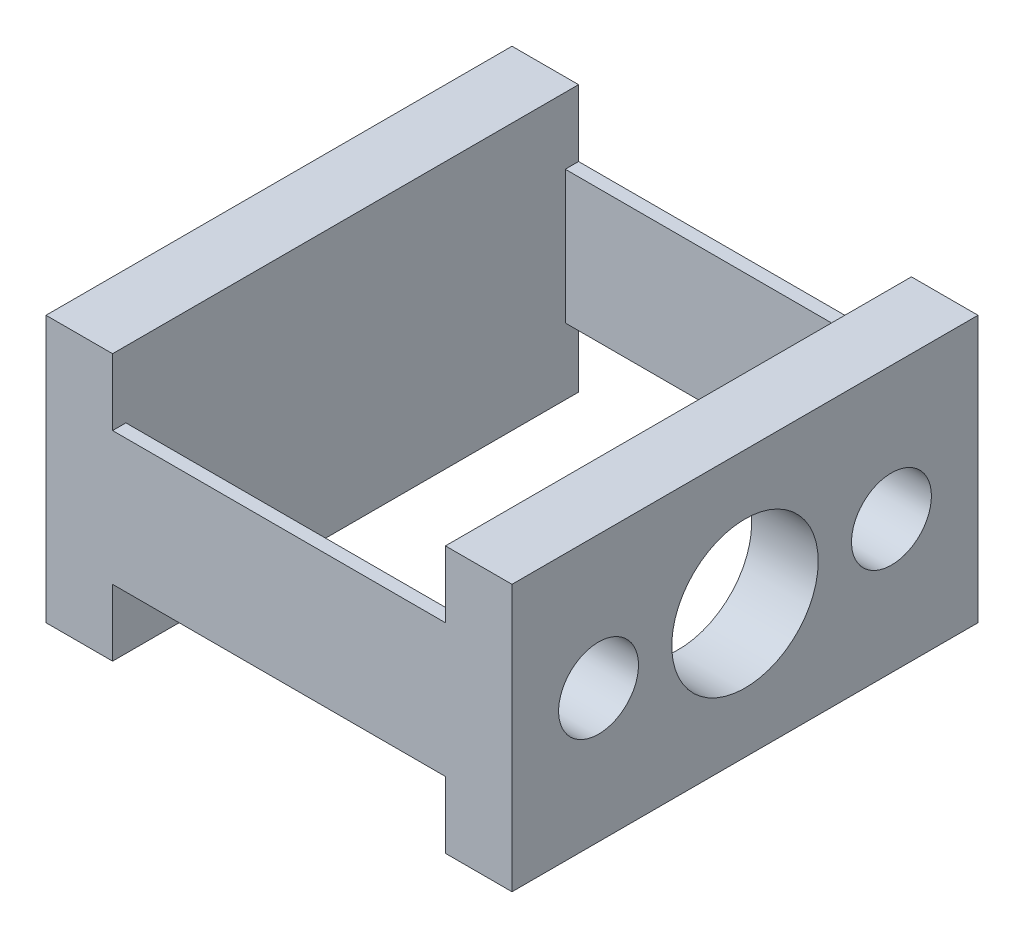
ISO-10303-21;
HEADER;
FILE_DESCRIPTION(('STEP AP214'),'2;1');
FILE_NAME('part.step','',(''),(''),'','','');
FILE_SCHEMA(('AUTOMOTIVE_DESIGN { 1 0 10303 214 1 1 1 1 }'));
ENDSEC;
DATA;
#1=APPLICATION_CONTEXT('core data for automotive mechanical design processes');
#2=APPLICATION_PROTOCOL_DEFINITION('international standard','automotive_design',2000,#1);
#3=PRODUCT_CONTEXT('',#1,'mechanical');
#4=PRODUCT('Part','Part','',(#3));
#5=PRODUCT_RELATED_PRODUCT_CATEGORY('part','',(#4));
#6=PRODUCT_DEFINITION_FORMATION('','',#4);
#7=PRODUCT_DEFINITION_CONTEXT('part definition',#1,'design');
#8=PRODUCT_DEFINITION('design','',#6,#7);
#9=PRODUCT_DEFINITION_SHAPE('','',#8);
#10=(LENGTH_UNIT() NAMED_UNIT(*) SI_UNIT(.MILLI.,.METRE.));
#11=(NAMED_UNIT(*) PLANE_ANGLE_UNIT() SI_UNIT($,.RADIAN.));
#12=(NAMED_UNIT(*) SI_UNIT($,.STERADIAN.) SOLID_ANGLE_UNIT());
#13=UNCERTAINTY_MEASURE_WITH_UNIT(LENGTH_MEASURE(1.E-05),#10,'distance_accuracy_value','');
#14=(GEOMETRIC_REPRESENTATION_CONTEXT(3) GLOBAL_UNCERTAINTY_ASSIGNED_CONTEXT((#13)) GLOBAL_UNIT_ASSIGNED_CONTEXT((#10,
#11,#12)) REPRESENTATION_CONTEXT('',''));
#15=CARTESIAN_POINT('',(0.,0.,0.));
#16=DIRECTION('',(0.,0.,1.));
#17=DIRECTION('',(1.,0.,0.));
#18=AXIS2_PLACEMENT_3D('',#15,#16,#17);
#19=CARTESIAN_POINT('',(32.8580938077791,-20.,70.));
#20=DIRECTION('',(0.,1.,0.));
#21=DIRECTION('',(-1.,0.,0.));
#22=AXIS2_PLACEMENT_3D('',#19,#20,#21);
#23=PLANE('',#22);
#24=DIRECTION('',(0.,0.,-1.));
#25=VECTOR('',#24,1.);
#26=CARTESIAN_POINT('',(-17.1419061922209,-20.,70.));
#27=LINE('',#26,#25);
#28=CARTESIAN_POINT('',(-17.1419061922209,-20.,70.));
#29=VERTEX_POINT('',#28);
#30=CARTESIAN_POINT('',(-17.1419061922209,-20.,68.));
#31=VERTEX_POINT('',#30);
#32=EDGE_CURVE('E192',#29,#31,#27,.T.);
#33=ORIENTED_EDGE('',*,*,#32,.T.);
#34=DIRECTION('',(1.,0.,0.));
#35=VECTOR('',#34,1.);
#36=CARTESIAN_POINT('',(32.8580938077791,-20.,68.));
#37=LINE('',#36,#35);
#38=CARTESIAN_POINT('',(32.8580938077791,-20.,68.));
#39=VERTEX_POINT('',#38);
#40=EDGE_CURVE('E248',#31,#39,#37,.T.);
#41=ORIENTED_EDGE('',*,*,#40,.T.);
#42=DIRECTION('',(0.,0.,-1.));
#43=VECTOR('',#42,1.);
#44=CARTESIAN_POINT('',(32.8580938077791,-20.,70.));
#45=LINE('',#44,#43);
#46=CARTESIAN_POINT('',(32.8580938077791,-20.,70.));
#47=VERTEX_POINT('',#46);
#48=EDGE_CURVE('E189',#47,#39,#45,.T.);
#49=ORIENTED_EDGE('',*,*,#48,.F.);
#50=DIRECTION('',(1.,0.,0.));
#51=VECTOR('',#50,1.);
#52=CARTESIAN_POINT('',(32.8580938077791,-20.,70.));
#53=LINE('',#52,#51);
#54=EDGE_CURVE('E256',#29,#47,#53,.T.);
#55=ORIENTED_EDGE('',*,*,#54,.F.);
#56=EDGE_LOOP('',(#33,#41,#49,#55));
#57=FACE_BOUND('',#56,.T.);
#58=ADVANCED_FACE('F33',(#57),#23,.F.);
#59=CARTESIAN_POINT('',(-17.1419061922209,0.,70.));
#60=DIRECTION('',(0.,-1.,0.));
#61=DIRECTION('',(0.,0.,-1.));
#62=AXIS2_PLACEMENT_3D('',#59,#60,#61);
#63=PLANE('',#62);
#64=DIRECTION('',(0.,0.,-1.));
#65=VECTOR('',#64,1.);
#66=CARTESIAN_POINT('',(32.8580938077791,0.,70.));
#67=LINE('',#66,#65);
#68=CARTESIAN_POINT('',(32.8580938077791,0.,70.));
#69=VERTEX_POINT('',#68);
#70=CARTESIAN_POINT('',(32.8580938077791,0.,68.));
#71=VERTEX_POINT('',#70);
#72=EDGE_CURVE('E174',#69,#71,#67,.T.);
#73=ORIENTED_EDGE('',*,*,#72,.T.);
#74=DIRECTION('',(1.,0.,0.));
#75=VECTOR('',#74,1.);
#76=CARTESIAN_POINT('',(-17.1419061922209,0.,68.));
#77=LINE('',#76,#75);
#78=CARTESIAN_POINT('',(-17.1419061922209,0.,68.));
#79=VERTEX_POINT('',#78);
#80=EDGE_CURVE('E157',#79,#71,#77,.T.);
#81=ORIENTED_EDGE('',*,*,#80,.F.);
#82=DIRECTION('',(0.,0.,-1.));
#83=VECTOR('',#82,1.);
#84=CARTESIAN_POINT('',(-17.1419061922209,0.,70.));
#85=LINE('',#84,#83);
#86=CARTESIAN_POINT('',(-17.1419061922209,0.,70.));
#87=VERTEX_POINT('',#86);
#88=EDGE_CURVE('E164',#87,#79,#85,.T.);
#89=ORIENTED_EDGE('',*,*,#88,.F.);
#90=DIRECTION('',(-1.,0.,0.));
#91=VECTOR('',#90,1.);
#92=CARTESIAN_POINT('',(-17.1419061922209,0.,70.));
#93=LINE('',#92,#91);
#94=EDGE_CURVE('E165',#69,#87,#93,.T.);
#95=ORIENTED_EDGE('',*,*,#94,.F.);
#96=EDGE_LOOP('',(#73,#81,#89,#95));
#97=FACE_BOUND('',#96,.T.);
#98=ADVANCED_FACE('F340',(#97),#63,.F.);
#99=CARTESIAN_POINT('',(-27.1419061922209,10.,70.));
#100=DIRECTION('',(0.,-1.,0.));
#101=DIRECTION('',(1.,0.,0.));
#102=AXIS2_PLACEMENT_3D('',#99,#100,#101);
#103=PLANE('',#102);
#104=DIRECTION('',(-1.,0.,0.));
#105=VECTOR('',#104,1.);
#106=CARTESIAN_POINT('',(-27.1419061922209,10.,0.));
#107=LINE('',#106,#105);
#108=CARTESIAN_POINT('',(-17.1419061922209,10.,0.));
#109=VERTEX_POINT('',#108);
#110=CARTESIAN_POINT('',(-27.1419061922209,10.,0.));
#111=VERTEX_POINT('',#110);
#112=EDGE_CURVE('E212',#109,#111,#107,.T.);
#113=ORIENTED_EDGE('',*,*,#112,.T.);
#114=DIRECTION('',(0.,0.,-1.));
#115=VECTOR('',#114,1.);
#116=CARTESIAN_POINT('',(-27.1419061922209,10.,70.));
#117=LINE('',#116,#115);
#118=CARTESIAN_POINT('',(-27.1419061922209,10.,70.));
#119=VERTEX_POINT('',#118);
#120=EDGE_CURVE('E41',#119,#111,#117,.T.);
#121=ORIENTED_EDGE('',*,*,#120,.F.);
#122=DIRECTION('',(-1.,0.,0.));
#123=VECTOR('',#122,1.);
#124=CARTESIAN_POINT('',(-27.1419061922209,10.,70.));
#125=LINE('',#124,#123);
#126=CARTESIAN_POINT('',(-17.1419061922209,10.,70.));
#127=VERTEX_POINT('',#126);
#128=EDGE_CURVE('E241',#127,#119,#125,.T.);
#129=ORIENTED_EDGE('',*,*,#128,.F.);
#130=DIRECTION('',(0.,0.,-1.));
#131=VECTOR('',#130,1.);
#132=CARTESIAN_POINT('',(-17.1419061922209,10.,70.));
#133=LINE('',#132,#131);
#134=EDGE_CURVE('E11',#127,#109,#133,.T.);
#135=ORIENTED_EDGE('',*,*,#134,.T.);
#136=EDGE_LOOP('',(#113,#121,#129,#135));
#137=FACE_BOUND('',#136,.T.);
#138=ADVANCED_FACE('F35',(#137),#103,.F.);
#139=CARTESIAN_POINT('',(-27.1419061922209,-30.,70.));
#140=DIRECTION('',(1.,0.,0.));
#141=DIRECTION('',(0.,0.,-1.));
#142=AXIS2_PLACEMENT_3D('',#139,#140,#141);
#143=PLANE('',#142);
#144=DIRECTION('',(0.,-1.,0.));
#145=VECTOR('',#144,1.);
#146=CARTESIAN_POINT('',(-27.1419061922209,-30.,0.));
#147=LINE('',#146,#145);
#148=CARTESIAN_POINT('',(-27.1419061922209,-30.,0.));
#149=VERTEX_POINT('',#148);
#150=EDGE_CURVE('E206',#111,#149,#147,.T.);
#151=ORIENTED_EDGE('',*,*,#150,.T.);
#152=DIRECTION('',(0.,0.,-1.));
#153=VECTOR('',#152,1.);
#154=CARTESIAN_POINT('',(-27.1419061922209,-30.,70.));
#155=LINE('',#154,#153);
#156=CARTESIAN_POINT('',(-27.1419061922209,-30.,70.));
#157=VERTEX_POINT('',#156);
#158=EDGE_CURVE('E197',#157,#149,#155,.T.);
#159=ORIENTED_EDGE('',*,*,#158,.F.);
#160=DIRECTION('',(0.,-1.,0.));
#161=VECTOR('',#160,1.);
#162=CARTESIAN_POINT('',(-27.1419061922209,-30.,70.));
#163=LINE('',#162,#161);
#164=EDGE_CURVE('E207',#119,#157,#163,.T.);
#165=ORIENTED_EDGE('',*,*,#164,.F.);
#166=ORIENTED_EDGE('',*,*,#120,.T.);
#167=EDGE_LOOP('',(#151,#159,#165,#166));
#168=FACE_BOUND('',#167,.T.);
#169=ADVANCED_FACE('F204',(#168),#143,.F.);
#170=CARTESIAN_POINT('',(-17.1419061922209,-30.,70.));
#171=DIRECTION('',(0.,1.,0.));
#172=DIRECTION('',(0.,0.,1.));
#173=AXIS2_PLACEMENT_3D('',#170,#171,#172);
#174=PLANE('',#173);
#175=DIRECTION('',(1.,0.,0.));
#176=VECTOR('',#175,1.);
#177=CARTESIAN_POINT('',(-17.1419061922209,-30.,0.));
#178=LINE('',#177,#176);
#179=CARTESIAN_POINT('',(-17.1419061922209,-30.,0.));
#180=VERTEX_POINT('',#179);
#181=EDGE_CURVE('E215',#149,#180,#178,.T.);
#182=ORIENTED_EDGE('',*,*,#181,.T.);
#183=DIRECTION('',(0.,0.,-1.));
#184=VECTOR('',#183,1.);
#185=CARTESIAN_POINT('',(-17.1419061922209,-30.,70.));
#186=LINE('',#185,#184);
#187=CARTESIAN_POINT('',(-17.1419061922209,-30.,70.));
#188=VERTEX_POINT('',#187);
#189=EDGE_CURVE('E195',#188,#180,#186,.T.);
#190=ORIENTED_EDGE('',*,*,#189,.F.);
#191=DIRECTION('',(1.,0.,0.));
#192=VECTOR('',#191,1.);
#193=CARTESIAN_POINT('',(-17.1419061922209,-30.,70.));
#194=LINE('',#193,#192);
#195=EDGE_CURVE('E252',#157,#188,#194,.T.);
#196=ORIENTED_EDGE('',*,*,#195,.F.);
#197=ORIENTED_EDGE('',*,*,#158,.T.);
#198=EDGE_LOOP('',(#182,#190,#196,#197));
#199=FACE_BOUND('',#198,.T.);
#200=ADVANCED_FACE('F334',(#199),#174,.F.);
#201=CARTESIAN_POINT('',(-17.1419061922209,-20.,70.));
#202=DIRECTION('',(-1.,0.,0.));
#203=DIRECTION('',(0.,-1.,0.));
#204=AXIS2_PLACEMENT_3D('',#201,#202,#203);
#205=PLANE('',#204);
#206=CARTESIAN_POINT('',(-17.1419061922209,-20.,2.));
#207=VERTEX_POINT('',#206);
#208=CARTESIAN_POINT('',(-17.1419061922209,-20.,0.));
#209=VERTEX_POINT('',#208);
#210=EDGE_CURVE('E150',#207,#209,#27,.T.);
#211=ORIENTED_EDGE('',*,*,#210,.F.);
#212=DIRECTION('',(0.,1.,0.));
#213=VECTOR('',#212,1.);
#214=CARTESIAN_POINT('',(-17.1419061922209,-30.,2.));
#215=LINE('',#214,#213);
#216=CARTESIAN_POINT('',(-17.1419061922209,0.,2.));
#217=VERTEX_POINT('',#216);
#218=EDGE_CURVE('E48',#207,#217,#215,.T.);
#219=ORIENTED_EDGE('',*,*,#218,.T.);
#220=CARTESIAN_POINT('',(-17.1419061922209,0.,0.));
#221=VERTEX_POINT('',#220);
#222=EDGE_CURVE('E147',#217,#221,#85,.T.);
#223=ORIENTED_EDGE('',*,*,#222,.T.);
#224=DIRECTION('',(0.,1.,0.));
#225=VECTOR('',#224,1.);
#226=CARTESIAN_POINT('',(-17.1419061922209,10.,0.));
#227=LINE('',#226,#225);
#228=EDGE_CURVE('E219',#221,#109,#227,.T.);
#229=ORIENTED_EDGE('',*,*,#228,.T.);
#230=ORIENTED_EDGE('',*,*,#134,.F.);
#231=DIRECTION('',(0.,1.,0.));
#232=VECTOR('',#231,1.);
#233=CARTESIAN_POINT('',(-17.1419061922209,10.,70.));
#234=LINE('',#233,#232);
#235=EDGE_CURVE('E239',#87,#127,#234,.T.);
#236=ORIENTED_EDGE('',*,*,#235,.F.);
#237=ORIENTED_EDGE('',*,*,#88,.T.);
#238=DIRECTION('',(0.,1.,0.));
#239=VECTOR('',#238,1.);
#240=CARTESIAN_POINT('',(-17.1419061922209,-30.,68.));
#241=LINE('',#240,#239);
#242=EDGE_CURVE('E151',#31,#79,#241,.T.);
#243=ORIENTED_EDGE('',*,*,#242,.F.);
#244=ORIENTED_EDGE('',*,*,#32,.F.);
#245=DIRECTION('',(0.,1.,0.));
#246=VECTOR('',#245,1.);
#247=CARTESIAN_POINT('',(-17.1419061922209,-20.,70.));
#248=LINE('',#247,#246);
#249=EDGE_CURVE('E254',#188,#29,#248,.T.);
#250=ORIENTED_EDGE('',*,*,#249,.F.);
#251=ORIENTED_EDGE('',*,*,#189,.T.);
#252=DIRECTION('',(0.,1.,0.));
#253=VECTOR('',#252,1.);
#254=CARTESIAN_POINT('',(-17.1419061922209,-20.,0.));
#255=LINE('',#254,#253);
#256=EDGE_CURVE('E217',#180,#209,#255,.T.);
#257=ORIENTED_EDGE('',*,*,#256,.T.);
#258=EDGE_LOOP('',(#211,#219,#223,#229,#230,#236,#237,#243,#244,#250,#251,#257));
#259=FACE_BOUND('',#258,.T.);
#260=ADVANCED_FACE('F144',(#259),#205,.F.);
#261=CARTESIAN_POINT('',(32.8580938077791,-20.,2.));
#262=VERTEX_POINT('',#261);
#263=CARTESIAN_POINT('',(32.8580938077791,-20.,0.));
#264=VERTEX_POINT('',#263);
#265=EDGE_CURVE('E188',#262,#264,#45,.T.);
#266=ORIENTED_EDGE('',*,*,#265,.F.);
#267=DIRECTION('',(-1.,0.,0.));
#268=VECTOR('',#267,1.);
#269=CARTESIAN_POINT('',(32.8580938077791,-20.,2.));
#270=LINE('',#269,#268);
#271=EDGE_CURVE('E267',#262,#207,#270,.T.);
#272=ORIENTED_EDGE('',*,*,#271,.T.);
#273=ORIENTED_EDGE('',*,*,#210,.T.);
#274=DIRECTION('',(1.,0.,0.));
#275=VECTOR('',#274,1.);
#276=CARTESIAN_POINT('',(32.8580938077791,-20.,0.));
#277=LINE('',#276,#275);
#278=EDGE_CURVE('E224',#209,#264,#277,.T.);
#279=ORIENTED_EDGE('',*,*,#278,.T.);
#280=EDGE_LOOP('',(#266,#272,#273,#279));
#281=FACE_BOUND('',#280,.T.);
#282=ADVANCED_FACE('F328',(#281),#23,.F.);
#283=CARTESIAN_POINT('',(42.8580938077791,-30.,70.));
#284=DIRECTION('',(0.,1.,0.));
#285=DIRECTION('',(-1.,0.,0.));
#286=AXIS2_PLACEMENT_3D('',#283,#284,#285);
#287=PLANE('',#286);
#288=DIRECTION('',(1.,0.,0.));
#289=VECTOR('',#288,1.);
#290=CARTESIAN_POINT('',(42.8580938077791,-30.,0.));
#291=LINE('',#290,#289);
#292=CARTESIAN_POINT('',(32.8580938077791,-30.,0.));
#293=VERTEX_POINT('',#292);
#294=CARTESIAN_POINT('',(42.8580938077791,-30.,0.));
#295=VERTEX_POINT('',#294);
#296=EDGE_CURVE('E230',#293,#295,#291,.T.);
#297=ORIENTED_EDGE('',*,*,#296,.T.);
#298=DIRECTION('',(0.,0.,-1.));
#299=VECTOR('',#298,1.);
#300=CARTESIAN_POINT('',(42.8580938077791,-30.,70.));
#301=LINE('',#300,#299);
#302=CARTESIAN_POINT('',(42.8580938077791,-30.,70.));
#303=VERTEX_POINT('',#302);
#304=EDGE_CURVE('E183',#303,#295,#301,.T.);
#305=ORIENTED_EDGE('',*,*,#304,.F.);
#306=DIRECTION('',(1.,0.,0.));
#307=VECTOR('',#306,1.);
#308=CARTESIAN_POINT('',(42.8580938077791,-30.,70.));
#309=LINE('',#308,#307);
#310=CARTESIAN_POINT('',(32.8580938077791,-30.,70.));
#311=VERTEX_POINT('',#310);
#312=EDGE_CURVE('E260',#311,#303,#309,.T.);
#313=ORIENTED_EDGE('',*,*,#312,.F.);
#314=DIRECTION('',(0.,0.,-1.));
#315=VECTOR('',#314,1.);
#316=CARTESIAN_POINT('',(32.8580938077791,-30.,70.));
#317=LINE('',#316,#315);
#318=EDGE_CURVE('E186',#311,#293,#317,.T.);
#319=ORIENTED_EDGE('',*,*,#318,.T.);
#320=EDGE_LOOP('',(#297,#305,#313,#319));
#321=FACE_BOUND('',#320,.T.);
#322=ADVANCED_FACE('F303',(#321),#287,.F.);
#323=CARTESIAN_POINT('',(42.8580938077791,10.,70.));
#324=DIRECTION('',(-1.,0.,0.));
#325=DIRECTION('',(0.,-1.,0.));
#326=AXIS2_PLACEMENT_3D('',#323,#324,#325);
#327=PLANE('',#326);
#328=CARTESIAN_POINT('',(42.8580938077791,-9.99999999999999,57.));
#329=DIRECTION('',(1.,0.,0.));
#330=DIRECTION('',(0.,0.,-1.));
#331=AXIS2_PLACEMENT_3D('',#328,#329,#330);
#332=CIRCLE('',#331,5.99999999999999);
#333=CARTESIAN_POINT('',(42.8580938077791,-9.99999999999999,51.));
#334=VERTEX_POINT('',#333);
#335=EDGE_CURVE('E293',#334,#334,#332,.T.);
#336=ORIENTED_EDGE('',*,*,#335,.F.);
#337=EDGE_LOOP('',(#336));
#338=FACE_BOUND('',#337,.T.);
#339=CARTESIAN_POINT('',(42.8580938077791,-9.99999999999999,13.));
#340=DIRECTION('',(1.,0.,0.));
#341=DIRECTION('',(0.,0.,-1.));
#342=AXIS2_PLACEMENT_3D('',#339,#340,#341);
#343=CIRCLE('',#342,6.);
#344=CARTESIAN_POINT('',(42.8580938077791,-9.99999999999999,7.00000000000001));
#345=VERTEX_POINT('',#344);
#346=EDGE_CURVE('E287',#345,#345,#343,.T.);
#347=ORIENTED_EDGE('',*,*,#346,.F.);
#348=EDGE_LOOP('',(#347));
#349=FACE_BOUND('',#348,.T.);
#350=CARTESIAN_POINT('',(42.8580938077791,-10.,35.));
#351=DIRECTION('',(1.,0.,0.));
#352=DIRECTION('',(0.,0.,-1.));
#353=AXIS2_PLACEMENT_3D('',#350,#351,#352);
#354=CIRCLE('',#353,11.);
#355=CARTESIAN_POINT('',(42.8580938077791,-10.,24.));
#356=VERTEX_POINT('',#355);
#357=EDGE_CURVE('E281',#356,#356,#354,.T.);
#358=ORIENTED_EDGE('',*,*,#357,.F.);
#359=EDGE_LOOP('',(#358));
#360=FACE_BOUND('',#359,.T.);
#361=DIRECTION('',(0.,1.,0.));
#362=VECTOR('',#361,1.);
#363=CARTESIAN_POINT('',(42.8580938077791,10.,0.));
#364=LINE('',#363,#362);
#365=CARTESIAN_POINT('',(42.8580938077791,10.,0.));
#366=VERTEX_POINT('',#365);
#367=EDGE_CURVE('E232',#295,#366,#364,.T.);
#368=ORIENTED_EDGE('',*,*,#367,.T.);
#369=DIRECTION('',(0.,0.,-1.));
#370=VECTOR('',#369,1.);
#371=CARTESIAN_POINT('',(42.8580938077791,10.,70.));
#372=LINE('',#371,#370);
#373=CARTESIAN_POINT('',(42.8580938077791,10.,70.));
#374=VERTEX_POINT('',#373);
#375=EDGE_CURVE('E180',#374,#366,#372,.T.);
#376=ORIENTED_EDGE('',*,*,#375,.F.);
#377=DIRECTION('',(0.,1.,0.));
#378=VECTOR('',#377,1.);
#379=CARTESIAN_POINT('',(42.8580938077791,10.,70.));
#380=LINE('',#379,#378);
#381=EDGE_CURVE('E262',#303,#374,#380,.T.);
#382=ORIENTED_EDGE('',*,*,#381,.F.);
#383=ORIENTED_EDGE('',*,*,#304,.T.);
#384=EDGE_LOOP('',(#368,#376,#382,#383));
#385=FACE_BOUND('',#384,.T.);
#386=ADVANCED_FACE('F299',(#338,#349,#360,#385),#327,.F.);
#387=CARTESIAN_POINT('',(32.8580938077791,10.,70.));
#388=DIRECTION('',(0.,-1.,0.));
#389=DIRECTION('',(0.,0.,-1.));
#390=AXIS2_PLACEMENT_3D('',#387,#388,#389);
#391=PLANE('',#390);
#392=DIRECTION('',(-1.,0.,0.));
#393=VECTOR('',#392,1.);
#394=CARTESIAN_POINT('',(32.8580938077791,10.,0.));
#395=LINE('',#394,#393);
#396=CARTESIAN_POINT('',(32.8580938077791,10.,0.));
#397=VERTEX_POINT('',#396);
#398=EDGE_CURVE('E234',#366,#397,#395,.T.);
#399=ORIENTED_EDGE('',*,*,#398,.T.);
#400=DIRECTION('',(0.,0.,-1.));
#401=VECTOR('',#400,1.);
#402=CARTESIAN_POINT('',(32.8580938077791,10.,70.));
#403=LINE('',#402,#401);
#404=CARTESIAN_POINT('',(32.8580938077791,10.,70.));
#405=VERTEX_POINT('',#404);
#406=EDGE_CURVE('E177',#405,#397,#403,.T.);
#407=ORIENTED_EDGE('',*,*,#406,.F.);
#408=DIRECTION('',(-1.,0.,0.));
#409=VECTOR('',#408,1.);
#410=CARTESIAN_POINT('',(32.8580938077791,10.,70.));
#411=LINE('',#410,#409);
#412=EDGE_CURVE('E264',#374,#405,#411,.T.);
#413=ORIENTED_EDGE('',*,*,#412,.F.);
#414=ORIENTED_EDGE('',*,*,#375,.T.);
#415=EDGE_LOOP('',(#399,#407,#413,#414));
#416=FACE_BOUND('',#415,.T.);
#417=ADVANCED_FACE('F302',(#416),#391,.F.);
#418=CARTESIAN_POINT('',(32.8580938077791,0.,70.));
#419=DIRECTION('',(1.,0.,0.));
#420=DIRECTION('',(0.,0.,-1.));
#421=AXIS2_PLACEMENT_3D('',#418,#419,#420);
#422=PLANE('',#421);
#423=CARTESIAN_POINT('',(32.8580938077791,-9.99999999999999,57.));
#424=DIRECTION('',(1.,0.,0.));
#425=DIRECTION('',(0.,0.,-1.));
#426=AXIS2_PLACEMENT_3D('',#423,#424,#425);
#427=CIRCLE('',#426,5.99999999999999);
#428=CARTESIAN_POINT('',(32.8580938077791,-9.99999999999999,51.));
#429=VERTEX_POINT('',#428);
#430=EDGE_CURVE('E290',#429,#429,#427,.F.);
#431=ORIENTED_EDGE('',*,*,#430,.F.);
#432=EDGE_LOOP('',(#431));
#433=FACE_BOUND('',#432,.T.);
#434=CARTESIAN_POINT('',(32.8580938077791,-9.99999999999999,13.));
#435=DIRECTION('',(1.,0.,0.));
#436=DIRECTION('',(0.,0.,-1.));
#437=AXIS2_PLACEMENT_3D('',#434,#435,#436);
#438=CIRCLE('',#437,6.);
#439=CARTESIAN_POINT('',(32.8580938077791,-9.99999999999999,7.00000000000001));
#440=VERTEX_POINT('',#439);
#441=EDGE_CURVE('E284',#440,#440,#438,.F.);
#442=ORIENTED_EDGE('',*,*,#441,.F.);
#443=EDGE_LOOP('',(#442));
#444=FACE_BOUND('',#443,.T.);
#445=CARTESIAN_POINT('',(32.8580938077791,-10.,35.));
#446=DIRECTION('',(1.,0.,0.));
#447=DIRECTION('',(0.,0.,-1.));
#448=AXIS2_PLACEMENT_3D('',#445,#446,#447);
#449=CIRCLE('',#448,11.);
#450=CARTESIAN_POINT('',(32.8580938077791,-10.,24.));
#451=VERTEX_POINT('',#450);
#452=EDGE_CURVE('E158',#451,#451,#449,.F.);
#453=ORIENTED_EDGE('',*,*,#452,.F.);
#454=EDGE_LOOP('',(#453));
#455=FACE_BOUND('',#454,.T.);
#456=DIRECTION('',(0.,-1.,0.));
#457=VECTOR('',#456,1.);
#458=CARTESIAN_POINT('',(32.8580938077791,0.,0.));
#459=LINE('',#458,#457);
#460=CARTESIAN_POINT('',(32.8580938077791,0.,0.));
#461=VERTEX_POINT('',#460);
#462=EDGE_CURVE('E235',#397,#461,#459,.T.);
#463=ORIENTED_EDGE('',*,*,#462,.T.);
#464=CARTESIAN_POINT('',(32.8580938077791,0.,2.));
#465=VERTEX_POINT('',#464);
#466=EDGE_CURVE('E168',#465,#461,#67,.T.);
#467=ORIENTED_EDGE('',*,*,#466,.F.);
#468=DIRECTION('',(0.,1.,0.));
#469=VECTOR('',#468,1.);
#470=CARTESIAN_POINT('',(32.8580938077791,-30.,2.));
#471=LINE('',#470,#469);
#472=EDGE_CURVE('E53',#262,#465,#471,.T.);
#473=ORIENTED_EDGE('',*,*,#472,.F.);
#474=ORIENTED_EDGE('',*,*,#265,.T.);
#475=DIRECTION('',(0.,-1.,0.));
#476=VECTOR('',#475,1.);
#477=CARTESIAN_POINT('',(32.8580938077791,-30.,0.));
#478=LINE('',#477,#476);
#479=EDGE_CURVE('E227',#264,#293,#478,.T.);
#480=ORIENTED_EDGE('',*,*,#479,.T.);
#481=ORIENTED_EDGE('',*,*,#318,.F.);
#482=DIRECTION('',(0.,-1.,0.));
#483=VECTOR('',#482,1.);
#484=CARTESIAN_POINT('',(32.8580938077791,-30.,70.));
#485=LINE('',#484,#483);
#486=EDGE_CURVE('E258',#47,#311,#485,.T.);
#487=ORIENTED_EDGE('',*,*,#486,.F.);
#488=ORIENTED_EDGE('',*,*,#48,.T.);
#489=DIRECTION('',(0.,1.,0.));
#490=VECTOR('',#489,1.);
#491=CARTESIAN_POINT('',(32.8580938077791,-30.,68.));
#492=LINE('',#491,#490);
#493=EDGE_CURVE('E270',#39,#71,#492,.T.);
#494=ORIENTED_EDGE('',*,*,#493,.T.);
#495=ORIENTED_EDGE('',*,*,#72,.F.);
#496=DIRECTION('',(0.,-1.,0.));
#497=VECTOR('',#496,1.);
#498=CARTESIAN_POINT('',(32.8580938077791,0.,70.));
#499=LINE('',#498,#497);
#500=EDGE_CURVE('E169',#405,#69,#499,.T.);
#501=ORIENTED_EDGE('',*,*,#500,.F.);
#502=ORIENTED_EDGE('',*,*,#406,.T.);
#503=EDGE_LOOP('',(#463,#467,#473,#474,#480,#481,#487,#488,#494,#495,#501,#502));
#504=FACE_BOUND('',#503,.T.);
#505=ADVANCED_FACE('F327',(#433,#444,#455,#504),#422,.F.);
#506=ORIENTED_EDGE('',*,*,#222,.F.);
#507=DIRECTION('',(-1.,0.,0.));
#508=VECTOR('',#507,1.);
#509=CARTESIAN_POINT('',(-17.1419061922209,0.,2.));
#510=LINE('',#509,#508);
#511=EDGE_CURVE('E153',#465,#217,#510,.T.);
#512=ORIENTED_EDGE('',*,*,#511,.F.);
#513=ORIENTED_EDGE('',*,*,#466,.T.);
#514=DIRECTION('',(-1.,0.,0.));
#515=VECTOR('',#514,1.);
#516=CARTESIAN_POINT('',(-17.1419061922209,0.,0.));
#517=LINE('',#516,#515);
#518=EDGE_CURVE('E162',#461,#221,#517,.T.);
#519=ORIENTED_EDGE('',*,*,#518,.T.);
#520=EDGE_LOOP('',(#506,#512,#513,#519));
#521=FACE_BOUND('',#520,.T.);
#522=ADVANCED_FACE('F160',(#521),#63,.F.);
#523=CARTESIAN_POINT('',(0.,0.,70.));
#524=DIRECTION('',(0.,0.,1.));
#525=DIRECTION('',(1.,0.,0.));
#526=AXIS2_PLACEMENT_3D('',#523,#524,#525);
#527=PLANE('',#526);
#528=ORIENTED_EDGE('',*,*,#235,.T.);
#529=ORIENTED_EDGE('',*,*,#128,.T.);
#530=ORIENTED_EDGE('',*,*,#164,.T.);
#531=ORIENTED_EDGE('',*,*,#195,.T.);
#532=ORIENTED_EDGE('',*,*,#249,.T.);
#533=ORIENTED_EDGE('',*,*,#54,.T.);
#534=ORIENTED_EDGE('',*,*,#486,.T.);
#535=ORIENTED_EDGE('',*,*,#312,.T.);
#536=ORIENTED_EDGE('',*,*,#381,.T.);
#537=ORIENTED_EDGE('',*,*,#412,.T.);
#538=ORIENTED_EDGE('',*,*,#500,.T.);
#539=ORIENTED_EDGE('',*,*,#94,.T.);
#540=EDGE_LOOP('',(#528,#529,#530,#531,#532,#533,#534,#535,#536,#537,#538,#539));
#541=FACE_BOUND('',#540,.T.);
#542=ADVANCED_FACE('F319',(#541),#527,.T.);
#543=CARTESIAN_POINT('',(0.,0.,0.));
#544=DIRECTION('',(0.,0.,1.));
#545=DIRECTION('',(1.,0.,0.));
#546=AXIS2_PLACEMENT_3D('',#543,#544,#545);
#547=PLANE('',#546);
#548=ORIENTED_EDGE('',*,*,#228,.F.);
#549=ORIENTED_EDGE('',*,*,#518,.F.);
#550=ORIENTED_EDGE('',*,*,#462,.F.);
#551=ORIENTED_EDGE('',*,*,#398,.F.);
#552=ORIENTED_EDGE('',*,*,#367,.F.);
#553=ORIENTED_EDGE('',*,*,#296,.F.);
#554=ORIENTED_EDGE('',*,*,#479,.F.);
#555=ORIENTED_EDGE('',*,*,#278,.F.);
#556=ORIENTED_EDGE('',*,*,#256,.F.);
#557=ORIENTED_EDGE('',*,*,#181,.F.);
#558=ORIENTED_EDGE('',*,*,#150,.F.);
#559=ORIENTED_EDGE('',*,*,#112,.F.);
#560=EDGE_LOOP('',(#548,#549,#550,#551,#552,#553,#554,#555,#556,#557,#558,#559));
#561=FACE_BOUND('',#560,.T.);
#562=ADVANCED_FACE('F211',(#561),#547,.F.);
#563=CARTESIAN_POINT('',(-17.1419061922209,-30.,68.));
#564=DIRECTION('',(0.,0.,1.));
#565=DIRECTION('',(1.,0.,0.));
#566=AXIS2_PLACEMENT_3D('',#563,#564,#565);
#567=PLANE('',#566);
#568=ORIENTED_EDGE('',*,*,#242,.T.);
#569=ORIENTED_EDGE('',*,*,#80,.T.);
#570=ORIENTED_EDGE('',*,*,#493,.F.);
#571=ORIENTED_EDGE('',*,*,#40,.F.);
#572=EDGE_LOOP('',(#568,#569,#570,#571));
#573=FACE_BOUND('',#572,.T.);
#574=ADVANCED_FACE('F342',(#573),#567,.F.);
#575=CARTESIAN_POINT('',(-17.1419061922209,-30.,2.));
#576=DIRECTION('',(0.,0.,-1.));
#577=DIRECTION('',(-1.,0.,0.));
#578=AXIS2_PLACEMENT_3D('',#575,#576,#577);
#579=PLANE('',#578);
#580=ORIENTED_EDGE('',*,*,#472,.T.);
#581=ORIENTED_EDGE('',*,*,#511,.T.);
#582=ORIENTED_EDGE('',*,*,#218,.F.);
#583=ORIENTED_EDGE('',*,*,#271,.F.);
#584=EDGE_LOOP('',(#580,#581,#582,#583));
#585=FACE_BOUND('',#584,.T.);
#586=ADVANCED_FACE('F154',(#585),#579,.F.);
#587=CARTESIAN_POINT('',(1.74539543557097,-10.,35.));
#588=DIRECTION('',(1.,0.,0.));
#589=DIRECTION('',(0.,0.,-1.));
#590=AXIS2_PLACEMENT_3D('',#587,#588,#589);
#591=CYLINDRICAL_SURFACE('',#590,11.);
#592=ORIENTED_EDGE('',*,*,#452,.T.);
#593=EDGE_LOOP('',(#592));
#594=FACE_BOUND('',#593,.T.);
#595=ORIENTED_EDGE('',*,*,#357,.T.);
#596=EDGE_LOOP('',(#595));
#597=FACE_BOUND('',#596,.T.);
#598=ADVANCED_FACE('F429',(#594,#597),#591,.F.);
#599=CARTESIAN_POINT('',(15.8875310593019,-9.99999999999999,13.));
#600=DIRECTION('',(1.,0.,0.));
#601=DIRECTION('',(0.,0.,-1.));
#602=AXIS2_PLACEMENT_3D('',#599,#600,#601);
#603=CYLINDRICAL_SURFACE('',#602,6.);
#604=ORIENTED_EDGE('',*,*,#441,.T.);
#605=EDGE_LOOP('',(#604));
#606=FACE_BOUND('',#605,.T.);
#607=ORIENTED_EDGE('',*,*,#346,.T.);
#608=EDGE_LOOP('',(#607));
#609=FACE_BOUND('',#608,.T.);
#610=ADVANCED_FACE('F438',(#606,#609),#603,.F.);
#611=CARTESIAN_POINT('',(15.8875310593019,-9.99999999999999,57.));
#612=DIRECTION('',(1.,0.,0.));
#613=DIRECTION('',(0.,0.,-1.));
#614=AXIS2_PLACEMENT_3D('',#611,#612,#613);
#615=CYLINDRICAL_SURFACE('',#614,5.99999999999999);
#616=ORIENTED_EDGE('',*,*,#430,.T.);
#617=EDGE_LOOP('',(#616));
#618=FACE_BOUND('',#617,.T.);
#619=ORIENTED_EDGE('',*,*,#335,.T.);
#620=EDGE_LOOP('',(#619));
#621=FACE_BOUND('',#620,.T.);
#622=ADVANCED_FACE('F297',(#618,#621),#615,.F.);
#623=CLOSED_SHELL('',(#58,#98,#138,#169,#200,#260,#282,#322,#386,#417,#505,#522,#542,#562,#574,
#586,#598,#610,#622));
#624=MANIFOLD_SOLID_BREP('B2',#623);
#625=ADVANCED_BREP_SHAPE_REPRESENTATION('',(#18,#624),#14);
#626=SHAPE_DEFINITION_REPRESENTATION(#9,#625);
ENDSEC;
END-ISO-10303-21;
